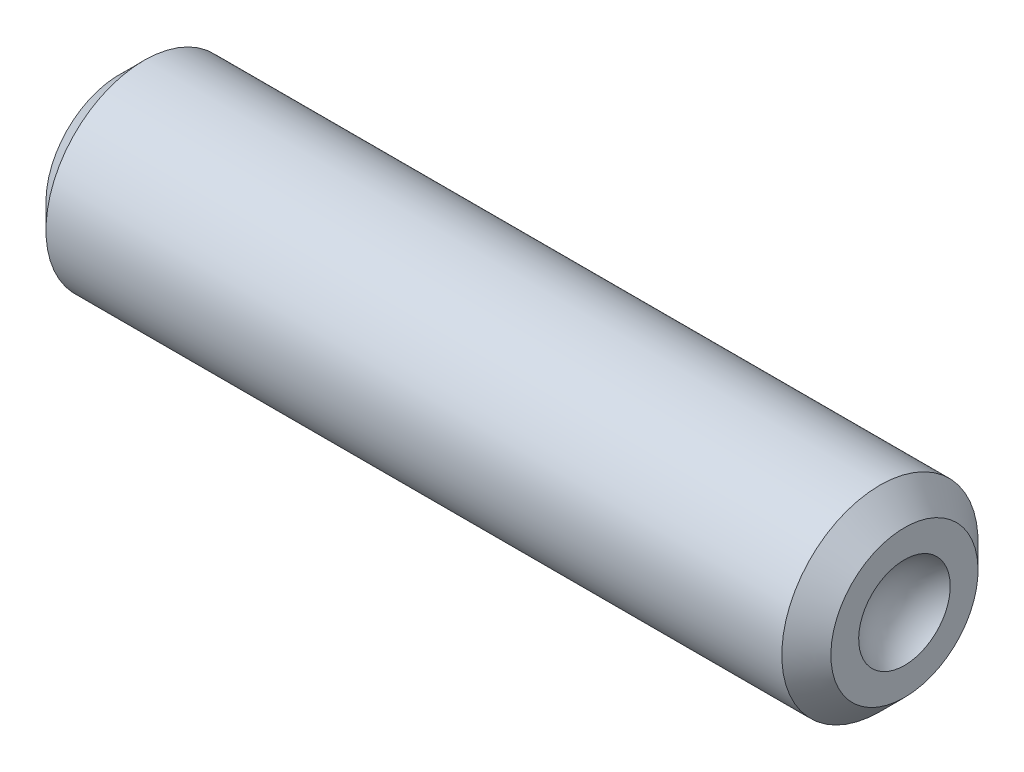
ISO-10303-21;
HEADER;
FILE_DESCRIPTION(('STEP AP214'),'2;1');
FILE_NAME('part.step','',(''),(''),'','','');
FILE_SCHEMA(('AUTOMOTIVE_DESIGN { 1 0 10303 214 1 1 1 1 }'));
ENDSEC;
DATA;
#1=APPLICATION_CONTEXT('core data for automotive mechanical design processes');
#2=APPLICATION_PROTOCOL_DEFINITION('international standard','automotive_design',2000,#1);
#3=PRODUCT_CONTEXT('',#1,'mechanical');
#4=PRODUCT('Part','Part','',(#3));
#5=PRODUCT_RELATED_PRODUCT_CATEGORY('part','',(#4));
#6=PRODUCT_DEFINITION_FORMATION('','',#4);
#7=PRODUCT_DEFINITION_CONTEXT('part definition',#1,'design');
#8=PRODUCT_DEFINITION('design','',#6,#7);
#9=PRODUCT_DEFINITION_SHAPE('','',#8);
#10=(LENGTH_UNIT() NAMED_UNIT(*) SI_UNIT(.MILLI.,.METRE.));
#11=(NAMED_UNIT(*) PLANE_ANGLE_UNIT() SI_UNIT($,.RADIAN.));
#12=(NAMED_UNIT(*) SI_UNIT($,.STERADIAN.) SOLID_ANGLE_UNIT());
#13=UNCERTAINTY_MEASURE_WITH_UNIT(LENGTH_MEASURE(1.E-05),#10,'distance_accuracy_value','');
#14=(GEOMETRIC_REPRESENTATION_CONTEXT(3) GLOBAL_UNCERTAINTY_ASSIGNED_CONTEXT((#13)) GLOBAL_UNIT_ASSIGNED_CONTEXT((#10,
#11,#12)) REPRESENTATION_CONTEXT('',''));
#15=CARTESIAN_POINT('',(0.,0.,0.));
#16=DIRECTION('',(0.,0.,1.));
#17=DIRECTION('',(1.,0.,0.));
#18=AXIS2_PLACEMENT_3D('',#15,#16,#17);
#19=CARTESIAN_POINT('',(0.,0.,0.));
#20=DIRECTION('',(1.,0.,0.));
#21=DIRECTION('',(0.,1.,0.));
#22=AXIS2_PLACEMENT_3D('',#19,#20,#21);
#23=PLANE('',#22);
#24=DIRECTION('',(0.,-0.5,-0.866025403784439));
#25=VECTOR('',#24,1.);
#26=CARTESIAN_POINT('',(0.,0.866025403784439,0.));
#27=LINE('',#26,#25);
#28=CARTESIAN_POINT('',(0.,0.866025403784439,0.));
#29=VERTEX_POINT('',#28);
#30=CARTESIAN_POINT('',(0.,0.43301270189222,-0.75));
#31=VERTEX_POINT('',#30);
#32=EDGE_CURVE('E107',#29,#31,#27,.T.);
#33=ORIENTED_EDGE('',*,*,#32,.F.);
#34=DIRECTION('',(0.,0.5,-0.866025403784439));
#35=VECTOR('',#34,1.);
#36=CARTESIAN_POINT('',(0.,0.433012701892219,0.75));
#37=LINE('',#36,#35);
#38=CARTESIAN_POINT('',(0.,0.433012701892219,0.75));
#39=VERTEX_POINT('',#38);
#40=EDGE_CURVE('E49',#39,#29,#37,.T.);
#41=ORIENTED_EDGE('',*,*,#40,.F.);
#42=DIRECTION('',(0.,1.,0.));
#43=VECTOR('',#42,1.);
#44=CARTESIAN_POINT('',(0.,-0.43301270189222,0.75));
#45=LINE('',#44,#43);
#46=CARTESIAN_POINT('',(0.,-0.43301270189222,0.75));
#47=VERTEX_POINT('',#46);
#48=EDGE_CURVE('E122',#47,#39,#45,.T.);
#49=ORIENTED_EDGE('',*,*,#48,.F.);
#50=DIRECTION('',(0.,0.5,0.866025403784439));
#51=VECTOR('',#50,1.);
#52=CARTESIAN_POINT('',(0.,-0.866025403784439,0.));
#53=LINE('',#52,#51);
#54=CARTESIAN_POINT('',(0.,-0.866025403784439,0.));
#55=VERTEX_POINT('',#54);
#56=EDGE_CURVE('E116',#55,#47,#53,.T.);
#57=ORIENTED_EDGE('',*,*,#56,.F.);
#58=DIRECTION('',(0.,-0.5,0.866025403784439));
#59=VECTOR('',#58,1.);
#60=CARTESIAN_POINT('',(0.,-0.433012701892219,-0.75));
#61=LINE('',#60,#59);
#62=CARTESIAN_POINT('',(0.,-0.433012701892219,-0.75));
#63=VERTEX_POINT('',#62);
#64=EDGE_CURVE('E114',#63,#55,#61,.T.);
#65=ORIENTED_EDGE('',*,*,#64,.F.);
#66=DIRECTION('',(0.,-1.,0.));
#67=VECTOR('',#66,1.);
#68=CARTESIAN_POINT('',(0.,0.43301270189222,-0.75));
#69=LINE('',#68,#67);
#70=EDGE_CURVE('E100',#31,#63,#69,.T.);
#71=ORIENTED_EDGE('',*,*,#70,.F.);
#72=EDGE_LOOP('',(#33,#41,#49,#57,#65,#71));
#73=FACE_BOUND('',#72,.T.);
#74=CARTESIAN_POINT('',(0.,0.,0.));
#75=DIRECTION('',(-1.,0.,0.));
#76=DIRECTION('',(0.,-1.,0.));
#77=AXIS2_PLACEMENT_3D('',#74,#75,#76);
#78=CIRCLE('',#77,1.125);
#79=CARTESIAN_POINT('',(0.,-1.125,0.));
#80=VERTEX_POINT('',#79);
#81=EDGE_CURVE('E12',#80,#80,#78,.T.);
#82=ORIENTED_EDGE('',*,*,#81,.T.);
#83=EDGE_LOOP('',(#82));
#84=FACE_BOUND('',#83,.T.);
#85=ADVANCED_FACE('F35',(#73,#84),#23,.F.);
#86=CARTESIAN_POINT('',(0.375000000000001,0.,0.));
#87=DIRECTION('',(1.,0.,0.));
#88=DIRECTION('',(0.,1.,0.));
#89=AXIS2_PLACEMENT_3D('',#86,#87,#88);
#90=CONICAL_SURFACE('',#89,1.5,0.785398163397447);
#91=ORIENTED_EDGE('',*,*,#81,.F.);
#92=EDGE_LOOP('',(#91));
#93=FACE_BOUND('',#92,.T.);
#94=CARTESIAN_POINT('',(0.375000000000001,0.,0.));
#95=DIRECTION('',(-1.,0.,0.));
#96=DIRECTION('',(0.,-1.,0.));
#97=AXIS2_PLACEMENT_3D('',#94,#95,#96);
#98=CIRCLE('',#97,1.5);
#99=CARTESIAN_POINT('',(0.375000000000001,-1.5,0.));
#100=VERTEX_POINT('',#99);
#101=EDGE_CURVE('E42',#100,#100,#98,.T.);
#102=ORIENTED_EDGE('',*,*,#101,.T.);
#103=EDGE_LOOP('',(#102));
#104=FACE_BOUND('',#103,.T.);
#105=ADVANCED_FACE('F145',(#93,#104),#90,.T.);
#106=CARTESIAN_POINT('',(0.,0.,0.));
#107=DIRECTION('',(-1.,0.,0.));
#108=DIRECTION('',(0.,-1.,0.));
#109=AXIS2_PLACEMENT_3D('',#106,#107,#108);
#110=CYLINDRICAL_SURFACE('',#109,1.5);
#111=ORIENTED_EDGE('',*,*,#101,.F.);
#112=EDGE_LOOP('',(#111));
#113=FACE_BOUND('',#112,.T.);
#114=CARTESIAN_POINT('',(11.625,0.,0.));
#115=DIRECTION('',(-1.,0.,0.));
#116=DIRECTION('',(0.,-1.,0.));
#117=AXIS2_PLACEMENT_3D('',#114,#115,#116);
#118=CIRCLE('',#117,1.5);
#119=CARTESIAN_POINT('',(11.625,-1.5,0.));
#120=VERTEX_POINT('',#119);
#121=EDGE_CURVE('E140',#120,#120,#118,.T.);
#122=ORIENTED_EDGE('',*,*,#121,.T.);
#123=EDGE_LOOP('',(#122));
#124=FACE_BOUND('',#123,.T.);
#125=ADVANCED_FACE('F147',(#113,#124),#110,.T.);
#126=CARTESIAN_POINT('',(12.,0.,0.));
#127=DIRECTION('',(-1.,0.,0.));
#128=DIRECTION('',(0.,-1.,0.));
#129=AXIS2_PLACEMENT_3D('',#126,#127,#128);
#130=CONICAL_SURFACE('',#129,1.125,0.785398163397448);
#131=ORIENTED_EDGE('',*,*,#121,.F.);
#132=EDGE_LOOP('',(#131));
#133=FACE_BOUND('',#132,.T.);
#134=CARTESIAN_POINT('',(12.,0.,0.));
#135=DIRECTION('',(-1.,0.,0.));
#136=DIRECTION('',(0.,-1.,0.));
#137=AXIS2_PLACEMENT_3D('',#134,#135,#136);
#138=CIRCLE('',#137,1.125);
#139=CARTESIAN_POINT('',(12.,-1.125,0.));
#140=VERTEX_POINT('',#139);
#141=EDGE_CURVE('E137',#140,#140,#138,.T.);
#142=ORIENTED_EDGE('',*,*,#141,.T.);
#143=EDGE_LOOP('',(#142));
#144=FACE_BOUND('',#143,.T.);
#145=ADVANCED_FACE('F150',(#133,#144),#130,.T.);
#146=CARTESIAN_POINT('',(12.,1.125,0.));
#147=DIRECTION('',(-1.,0.,0.));
#148=DIRECTION('',(0.,-1.,0.));
#149=AXIS2_PLACEMENT_3D('',#146,#147,#148);
#150=PLANE('',#149);
#151=ORIENTED_EDGE('',*,*,#141,.F.);
#152=EDGE_LOOP('',(#151));
#153=FACE_BOUND('',#152,.T.);
#154=CARTESIAN_POINT('',(12.,0.,0.));
#155=DIRECTION('',(-1.,0.,0.));
#156=DIRECTION('',(0.,-1.,0.));
#157=AXIS2_PLACEMENT_3D('',#154,#155,#156);
#158=CIRCLE('',#157,0.7);
#159=CARTESIAN_POINT('',(12.,-0.7,0.));
#160=VERTEX_POINT('',#159);
#161=EDGE_CURVE('E134',#160,#160,#158,.T.);
#162=ORIENTED_EDGE('',*,*,#161,.T.);
#163=EDGE_LOOP('',(#162));
#164=FACE_BOUND('',#163,.T.);
#165=ADVANCED_FACE('F156',(#153,#164),#150,.F.);
#166=CARTESIAN_POINT('',(12.4658333333333,0.,0.));
#167=DIRECTION('',(-1.,0.,0.));
#168=DIRECTION('',(0.,-1.,0.));
#169=AXIS2_PLACEMENT_3D('',#166,#167,#168);
#170=SPHERICAL_SURFACE('',#169,0.840833333333333);
#171=ORIENTED_EDGE('',*,*,#161,.F.);
#172=EDGE_LOOP('',(#171));
#173=FACE_BOUND('',#172,.T.);
#174=ADVANCED_FACE('F162',(#173),#170,.F.);
#175=CARTESIAN_POINT('',(14.2912878474779,0.433012701892219,0.75));
#176=DIRECTION('',(0.,0.866025403784438,0.5));
#177=DIRECTION('',(0.,-0.5,0.866025403784439));
#178=AXIS2_PLACEMENT_3D('',#175,#176,#177);
#179=PLANE('',#178);
#180=DIRECTION('',(0.,-0.5,0.866025403784439));
#181=VECTOR('',#180,1.);
#182=CARTESIAN_POINT('',(10.,0.433012701892219,0.75));
#183=LINE('',#182,#181);
#184=CARTESIAN_POINT('',(10.,0.866025403784439,0.));
#185=VERTEX_POINT('',#184);
#186=CARTESIAN_POINT('',(10.,0.433012701892219,0.75));
#187=VERTEX_POINT('',#186);
#188=EDGE_CURVE('E68',#185,#187,#183,.T.);
#189=ORIENTED_EDGE('',*,*,#188,.T.);
#190=DIRECTION('',(-1.,0.,0.));
#191=VECTOR('',#190,1.);
#192=CARTESIAN_POINT('',(14.2912878474779,0.433012701892219,0.75));
#193=LINE('',#192,#191);
#194=EDGE_CURVE('E125',#187,#39,#193,.T.);
#195=ORIENTED_EDGE('',*,*,#194,.T.);
#196=ORIENTED_EDGE('',*,*,#40,.T.);
#197=DIRECTION('',(-1.,0.,0.));
#198=VECTOR('',#197,1.);
#199=CARTESIAN_POINT('',(14.2912878474779,0.866025403784439,0.));
#200=LINE('',#199,#198);
#201=EDGE_CURVE('E104',#185,#29,#200,.T.);
#202=ORIENTED_EDGE('',*,*,#201,.F.);
#203=EDGE_LOOP('',(#189,#195,#196,#202));
#204=FACE_BOUND('',#203,.T.);
#205=ADVANCED_FACE('F167',(#204),#179,.F.);
#206=CARTESIAN_POINT('',(14.2912878474779,-0.43301270189222,0.75));
#207=DIRECTION('',(0.,0.,1.));
#208=DIRECTION('',(0.,-1.,0.));
#209=AXIS2_PLACEMENT_3D('',#206,#207,#208);
#210=PLANE('',#209);
#211=DIRECTION('',(0.,-1.,0.));
#212=VECTOR('',#211,1.);
#213=CARTESIAN_POINT('',(10.,-0.43301270189222,0.75));
#214=LINE('',#213,#212);
#215=CARTESIAN_POINT('',(10.,-0.43301270189222,0.75));
#216=VERTEX_POINT('',#215);
#217=EDGE_CURVE('E267',#187,#216,#214,.T.);
#218=ORIENTED_EDGE('',*,*,#217,.T.);
#219=DIRECTION('',(-1.,0.,0.));
#220=VECTOR('',#219,1.);
#221=CARTESIAN_POINT('',(14.2912878474779,-0.43301270189222,0.75));
#222=LINE('',#221,#220);
#223=EDGE_CURVE('E127',#216,#47,#222,.T.);
#224=ORIENTED_EDGE('',*,*,#223,.T.);
#225=ORIENTED_EDGE('',*,*,#48,.T.);
#226=ORIENTED_EDGE('',*,*,#194,.F.);
#227=EDGE_LOOP('',(#218,#224,#225,#226));
#228=FACE_BOUND('',#227,.T.);
#229=ADVANCED_FACE('F172',(#228),#210,.F.);
#230=CARTESIAN_POINT('',(14.2912878474779,-0.866025403784439,0.));
#231=DIRECTION('',(0.,-0.866025403784439,0.5));
#232=DIRECTION('',(0.,-0.5,-0.866025403784439));
#233=AXIS2_PLACEMENT_3D('',#230,#231,#232);
#234=PLANE('',#233);
#235=DIRECTION('',(0.,-0.5,-0.866025403784439));
#236=VECTOR('',#235,1.);
#237=CARTESIAN_POINT('',(10.,-0.866025403784439,0.));
#238=LINE('',#237,#236);
#239=CARTESIAN_POINT('',(10.,-0.866025403784439,0.));
#240=VERTEX_POINT('',#239);
#241=EDGE_CURVE('E270',#216,#240,#238,.T.);
#242=ORIENTED_EDGE('',*,*,#241,.T.);
#243=DIRECTION('',(-1.,0.,0.));
#244=VECTOR('',#243,1.);
#245=CARTESIAN_POINT('',(14.2912878474779,-0.866025403784439,0.));
#246=LINE('',#245,#244);
#247=EDGE_CURVE('E129',#240,#55,#246,.T.);
#248=ORIENTED_EDGE('',*,*,#247,.T.);
#249=ORIENTED_EDGE('',*,*,#56,.T.);
#250=ORIENTED_EDGE('',*,*,#223,.F.);
#251=EDGE_LOOP('',(#242,#248,#249,#250));
#252=FACE_BOUND('',#251,.T.);
#253=ADVANCED_FACE('F217',(#252),#234,.F.);
#254=CARTESIAN_POINT('',(14.2912878474779,-0.43301270189222,-0.75));
#255=DIRECTION('',(0.,-0.866025403784439,-0.5));
#256=DIRECTION('',(0.,0.5,-0.866025403784439));
#257=AXIS2_PLACEMENT_3D('',#254,#255,#256);
#258=PLANE('',#257);
#259=DIRECTION('',(0.,0.5,-0.866025403784439));
#260=VECTOR('',#259,1.);
#261=CARTESIAN_POINT('',(10.,-0.433012701892219,-0.75));
#262=LINE('',#261,#260);
#263=CARTESIAN_POINT('',(10.,-0.433012701892219,-0.75));
#264=VERTEX_POINT('',#263);
#265=EDGE_CURVE('E58',#240,#264,#262,.T.);
#266=ORIENTED_EDGE('',*,*,#265,.T.);
#267=DIRECTION('',(-1.,0.,0.));
#268=VECTOR('',#267,1.);
#269=CARTESIAN_POINT('',(14.2912878474779,-0.43301270189222,-0.75));
#270=LINE('',#269,#268);
#271=EDGE_CURVE('E103',#264,#63,#270,.T.);
#272=ORIENTED_EDGE('',*,*,#271,.T.);
#273=ORIENTED_EDGE('',*,*,#64,.T.);
#274=ORIENTED_EDGE('',*,*,#247,.F.);
#275=EDGE_LOOP('',(#266,#272,#273,#274));
#276=FACE_BOUND('',#275,.T.);
#277=ADVANCED_FACE('F227',(#276),#258,.F.);
#278=CARTESIAN_POINT('',(14.2912878474779,0.43301270189222,-0.75));
#279=DIRECTION('',(0.,0.,-1.));
#280=DIRECTION('',(-1.,0.,0.));
#281=AXIS2_PLACEMENT_3D('',#278,#279,#280);
#282=PLANE('',#281);
#283=DIRECTION('',(0.,1.,0.));
#284=VECTOR('',#283,1.);
#285=CARTESIAN_POINT('',(10.,0.43301270189222,-0.75));
#286=LINE('',#285,#284);
#287=CARTESIAN_POINT('',(10.,0.43301270189222,-0.75));
#288=VERTEX_POINT('',#287);
#289=EDGE_CURVE('E102',#264,#288,#286,.T.);
#290=ORIENTED_EDGE('',*,*,#289,.T.);
#291=DIRECTION('',(-1.,0.,0.));
#292=VECTOR('',#291,1.);
#293=CARTESIAN_POINT('',(14.2912878474779,0.43301270189222,-0.75));
#294=LINE('',#293,#292);
#295=EDGE_CURVE('E95',#288,#31,#294,.T.);
#296=ORIENTED_EDGE('',*,*,#295,.T.);
#297=ORIENTED_EDGE('',*,*,#70,.T.);
#298=ORIENTED_EDGE('',*,*,#271,.F.);
#299=EDGE_LOOP('',(#290,#296,#297,#298));
#300=FACE_BOUND('',#299,.T.);
#301=ADVANCED_FACE('F97',(#300),#282,.F.);
#302=CARTESIAN_POINT('',(14.2912878474779,0.866025403784439,0.));
#303=DIRECTION('',(0.,0.866025403784439,-0.5));
#304=DIRECTION('',(0.,0.5,0.866025403784439));
#305=AXIS2_PLACEMENT_3D('',#302,#303,#304);
#306=PLANE('',#305);
#307=DIRECTION('',(0.,0.5,0.866025403784439));
#308=VECTOR('',#307,1.);
#309=CARTESIAN_POINT('',(10.,0.866025403784439,0.));
#310=LINE('',#309,#308);
#311=EDGE_CURVE('E77',#288,#185,#310,.T.);
#312=ORIENTED_EDGE('',*,*,#311,.T.);
#313=ORIENTED_EDGE('',*,*,#201,.T.);
#314=ORIENTED_EDGE('',*,*,#32,.T.);
#315=ORIENTED_EDGE('',*,*,#295,.F.);
#316=EDGE_LOOP('',(#312,#313,#314,#315));
#317=FACE_BOUND('',#316,.T.);
#318=ADVANCED_FACE('F108',(#317),#306,.F.);
#319=CARTESIAN_POINT('',(10.,1.125,0.));
#320=DIRECTION('',(-1.,0.,0.));
#321=DIRECTION('',(0.,-1.,0.));
#322=AXIS2_PLACEMENT_3D('',#319,#320,#321);
#323=PLANE('',#322);
#324=ORIENTED_EDGE('',*,*,#188,.F.);
#325=ORIENTED_EDGE('',*,*,#311,.F.);
#326=ORIENTED_EDGE('',*,*,#289,.F.);
#327=ORIENTED_EDGE('',*,*,#265,.F.);
#328=ORIENTED_EDGE('',*,*,#241,.F.);
#329=ORIENTED_EDGE('',*,*,#217,.F.);
#330=EDGE_LOOP('',(#324,#325,#326,#327,#328,#329));
#331=FACE_BOUND('',#330,.T.);
#332=ADVANCED_FACE('F253',(#331),#323,.T.);
#333=CLOSED_SHELL('',(#85,#105,#125,#145,#165,#174,#205,#229,#253,#277,#301,#318,#332));
#334=MANIFOLD_SOLID_BREP('B2',#333);
#335=ADVANCED_BREP_SHAPE_REPRESENTATION('',(#18,#334),#14);
#336=SHAPE_DEFINITION_REPRESENTATION(#9,#335);
ENDSEC;
END-ISO-10303-21;
